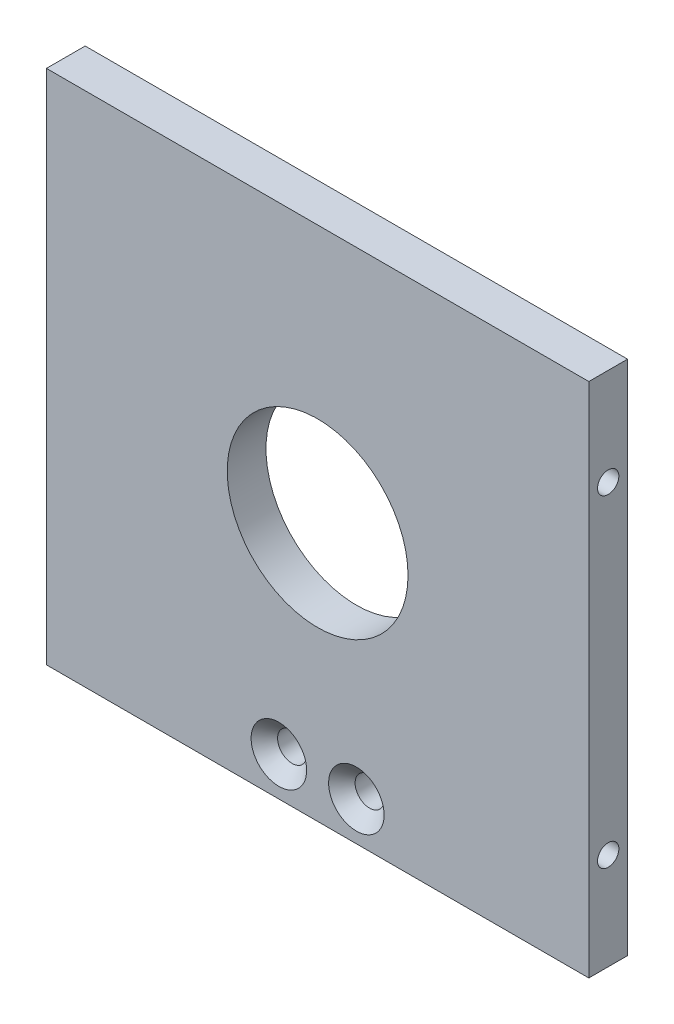
ISO-10303-21;
HEADER;
FILE_DESCRIPTION(('STEP AP214'),'2;1');
FILE_NAME('part.step','',(''),(''),'','','');
FILE_SCHEMA(('AUTOMOTIVE_DESIGN { 1 0 10303 214 1 1 1 1 }'));
ENDSEC;
DATA;
#1=APPLICATION_CONTEXT('core data for automotive mechanical design processes');
#2=APPLICATION_PROTOCOL_DEFINITION('international standard','automotive_design',2000,#1);
#3=PRODUCT_CONTEXT('',#1,'mechanical');
#4=PRODUCT('Part','Part','',(#3));
#5=PRODUCT_RELATED_PRODUCT_CATEGORY('part','',(#4));
#6=PRODUCT_DEFINITION_FORMATION('','',#4);
#7=PRODUCT_DEFINITION_CONTEXT('part definition',#1,'design');
#8=PRODUCT_DEFINITION('design','',#6,#7);
#9=PRODUCT_DEFINITION_SHAPE('','',#8);
#10=(LENGTH_UNIT() NAMED_UNIT(*) SI_UNIT(.MILLI.,.METRE.));
#11=(NAMED_UNIT(*) PLANE_ANGLE_UNIT() SI_UNIT($,.RADIAN.));
#12=(NAMED_UNIT(*) SI_UNIT($,.STERADIAN.) SOLID_ANGLE_UNIT());
#13=UNCERTAINTY_MEASURE_WITH_UNIT(LENGTH_MEASURE(1.E-05),#10,'distance_accuracy_value','');
#14=(GEOMETRIC_REPRESENTATION_CONTEXT(3) GLOBAL_UNCERTAINTY_ASSIGNED_CONTEXT((#13)) GLOBAL_UNIT_ASSIGNED_CONTEXT((#10,
#11,#12)) REPRESENTATION_CONTEXT('',''));
#15=CARTESIAN_POINT('',(0.,0.,0.));
#16=DIRECTION('',(0.,0.,1.));
#17=DIRECTION('',(1.,0.,0.));
#18=AXIS2_PLACEMENT_3D('',#15,#16,#17);
#19=CARTESIAN_POINT('',(0.,0.,3.));
#20=DIRECTION('',(0.,0.,-1.));
#21=DIRECTION('',(-1.,0.,0.));
#22=AXIS2_PLACEMENT_3D('',#19,#20,#21);
#23=PLANE('',#22);
#24=CARTESIAN_POINT('',(-6.,-34.,3.));
#25=DIRECTION('',(0.,0.,1.));
#26=DIRECTION('',(1.,0.,0.));
#27=AXIS2_PLACEMENT_3D('',#24,#25,#26);
#28=CIRCLE('',#27,4.3);
#29=CARTESIAN_POINT('',(-1.7,-34.,3.));
#30=VERTEX_POINT('',#29);
#31=EDGE_CURVE('E198',#30,#30,#28,.T.);
#32=ORIENTED_EDGE('',*,*,#31,.F.);
#33=EDGE_LOOP('',(#32));
#34=FACE_BOUND('',#33,.T.);
#35=CARTESIAN_POINT('',(6.,-34.,3.));
#36=DIRECTION('',(0.,0.,1.));
#37=DIRECTION('',(1.,0.,0.));
#38=AXIS2_PLACEMENT_3D('',#35,#36,#37);
#39=CIRCLE('',#38,4.3);
#40=CARTESIAN_POINT('',(10.3,-34.,3.));
#41=VERTEX_POINT('',#40);
#42=EDGE_CURVE('E187',#41,#41,#39,.T.);
#43=ORIENTED_EDGE('',*,*,#42,.F.);
#44=EDGE_LOOP('',(#43));
#45=FACE_BOUND('',#44,.T.);
#46=DIRECTION('',(0.,1.,0.));
#47=VECTOR('',#46,1.);
#48=CARTESIAN_POINT('',(42.,-40.,3.));
#49=LINE('',#48,#47);
#50=CARTESIAN_POINT('',(42.,-40.,3.));
#51=VERTEX_POINT('',#50);
#52=CARTESIAN_POINT('',(42.,40.,3.));
#53=VERTEX_POINT('',#52);
#54=EDGE_CURVE('E158',#51,#53,#49,.T.);
#55=ORIENTED_EDGE('',*,*,#54,.T.);
#56=DIRECTION('',(-1.,0.,0.));
#57=VECTOR('',#56,1.);
#58=CARTESIAN_POINT('',(-42.,40.,3.));
#59=LINE('',#58,#57);
#60=CARTESIAN_POINT('',(-42.,40.,3.));
#61=VERTEX_POINT('',#60);
#62=EDGE_CURVE('E100',#53,#61,#59,.T.);
#63=ORIENTED_EDGE('',*,*,#62,.T.);
#64=DIRECTION('',(0.,-1.,0.));
#65=VECTOR('',#64,1.);
#66=CARTESIAN_POINT('',(-42.,-40.,3.));
#67=LINE('',#66,#65);
#68=CARTESIAN_POINT('',(-42.,-40.,3.));
#69=VERTEX_POINT('',#68);
#70=EDGE_CURVE('E161',#61,#69,#67,.T.);
#71=ORIENTED_EDGE('',*,*,#70,.T.);
#72=DIRECTION('',(1.,0.,0.));
#73=VECTOR('',#72,1.);
#74=CARTESIAN_POINT('',(-42.,-40.,3.));
#75=LINE('',#74,#73);
#76=EDGE_CURVE('E66',#69,#51,#75,.T.);
#77=ORIENTED_EDGE('',*,*,#76,.T.);
#78=EDGE_LOOP('',(#55,#63,#71,#77));
#79=FACE_BOUND('',#78,.T.);
#80=CARTESIAN_POINT('',(0.,0.,3.));
#81=DIRECTION('',(0.,0.,1.));
#82=DIRECTION('',(1.,0.,0.));
#83=AXIS2_PLACEMENT_3D('',#80,#81,#82);
#84=CIRCLE('',#83,14.);
#85=CARTESIAN_POINT('',(14.,0.,3.));
#86=VERTEX_POINT('',#85);
#87=EDGE_CURVE('E151',#86,#86,#84,.T.);
#88=ORIENTED_EDGE('',*,*,#87,.F.);
#89=EDGE_LOOP('',(#88));
#90=FACE_BOUND('',#89,.T.);
#91=ADVANCED_FACE('F47',(#34,#45,#79,#90),#23,.F.);
#92=CARTESIAN_POINT('',(0.,0.,-3.));
#93=DIRECTION('',(0.,0.,-1.));
#94=DIRECTION('',(-1.,0.,0.));
#95=AXIS2_PLACEMENT_3D('',#92,#93,#94);
#96=PLANE('',#95);
#97=CARTESIAN_POINT('',(-6.,-34.,-3.));
#98=DIRECTION('',(0.,0.,-1.));
#99=DIRECTION('',(-1.,0.,0.));
#100=AXIS2_PLACEMENT_3D('',#97,#98,#99);
#101=CIRCLE('',#100,2.25);
#102=CARTESIAN_POINT('',(-8.25,-34.,-3.));
#103=VERTEX_POINT('',#102);
#104=EDGE_CURVE('E51',#103,#103,#101,.T.);
#105=ORIENTED_EDGE('',*,*,#104,.F.);
#106=EDGE_LOOP('',(#105));
#107=FACE_BOUND('',#106,.T.);
#108=CARTESIAN_POINT('',(6.,-34.,-3.));
#109=DIRECTION('',(0.,0.,-1.));
#110=DIRECTION('',(-1.,0.,0.));
#111=AXIS2_PLACEMENT_3D('',#108,#109,#110);
#112=CIRCLE('',#111,2.25);
#113=CARTESIAN_POINT('',(3.75,-34.,-3.));
#114=VERTEX_POINT('',#113);
#115=EDGE_CURVE('E130',#114,#114,#112,.T.);
#116=ORIENTED_EDGE('',*,*,#115,.F.);
#117=EDGE_LOOP('',(#116));
#118=FACE_BOUND('',#117,.T.);
#119=DIRECTION('',(0.,1.,0.));
#120=VECTOR('',#119,1.);
#121=CARTESIAN_POINT('',(42.,-40.,-3.));
#122=LINE('',#121,#120);
#123=CARTESIAN_POINT('',(42.,-40.,-3.));
#124=VERTEX_POINT('',#123);
#125=CARTESIAN_POINT('',(42.,40.,-3.));
#126=VERTEX_POINT('',#125);
#127=EDGE_CURVE('E154',#124,#126,#122,.T.);
#128=ORIENTED_EDGE('',*,*,#127,.F.);
#129=DIRECTION('',(1.,0.,0.));
#130=VECTOR('',#129,1.);
#131=CARTESIAN_POINT('',(-42.,-40.,-3.));
#132=LINE('',#131,#130);
#133=CARTESIAN_POINT('',(-42.,-40.,-3.));
#134=VERTEX_POINT('',#133);
#135=EDGE_CURVE('E93',#134,#124,#132,.T.);
#136=ORIENTED_EDGE('',*,*,#135,.F.);
#137=DIRECTION('',(0.,-1.,0.));
#138=VECTOR('',#137,1.);
#139=CARTESIAN_POINT('',(-42.,-40.,-3.));
#140=LINE('',#139,#138);
#141=CARTESIAN_POINT('',(-42.,40.,-3.));
#142=VERTEX_POINT('',#141);
#143=EDGE_CURVE('E87',#142,#134,#140,.T.);
#144=ORIENTED_EDGE('',*,*,#143,.F.);
#145=DIRECTION('',(-1.,0.,0.));
#146=VECTOR('',#145,1.);
#147=CARTESIAN_POINT('',(-42.,40.,-3.));
#148=LINE('',#147,#146);
#149=EDGE_CURVE('E169',#126,#142,#148,.T.);
#150=ORIENTED_EDGE('',*,*,#149,.F.);
#151=EDGE_LOOP('',(#128,#136,#144,#150));
#152=FACE_BOUND('',#151,.T.);
#153=CARTESIAN_POINT('',(0.,0.,-3.));
#154=DIRECTION('',(0.,0.,1.));
#155=DIRECTION('',(1.,0.,0.));
#156=AXIS2_PLACEMENT_3D('',#153,#154,#155);
#157=CIRCLE('',#156,14.);
#158=CARTESIAN_POINT('',(14.,0.,-3.));
#159=VERTEX_POINT('',#158);
#160=EDGE_CURVE('E150',#159,#159,#157,.T.);
#161=ORIENTED_EDGE('',*,*,#160,.T.);
#162=EDGE_LOOP('',(#161));
#163=FACE_BOUND('',#162,.T.);
#164=ADVANCED_FACE('F207',(#107,#118,#152,#163),#96,.T.);
#165=CARTESIAN_POINT('',(42.,-40.,3.));
#166=DIRECTION('',(-1.,0.,0.));
#167=DIRECTION('',(0.,0.,1.));
#168=AXIS2_PLACEMENT_3D('',#165,#166,#167);
#169=PLANE('',#168);
#170=CARTESIAN_POINT('',(42.,25.,0.));
#171=DIRECTION('',(1.,0.,0.));
#172=DIRECTION('',(0.,0.,-1.));
#173=AXIS2_PLACEMENT_3D('',#170,#171,#172);
#174=CIRCLE('',#173,1.64999999999999);
#175=CARTESIAN_POINT('',(42.,25.,-1.64999999999999));
#176=VERTEX_POINT('',#175);
#177=EDGE_CURVE('E124',#176,#176,#174,.T.);
#178=ORIENTED_EDGE('',*,*,#177,.F.);
#179=EDGE_LOOP('',(#178));
#180=FACE_BOUND('',#179,.T.);
#181=CARTESIAN_POINT('',(42.,-25.,0.));
#182=DIRECTION('',(1.,0.,0.));
#183=DIRECTION('',(0.,0.,-1.));
#184=AXIS2_PLACEMENT_3D('',#181,#182,#183);
#185=CIRCLE('',#184,1.64999999999999);
#186=CARTESIAN_POINT('',(42.,-25.,-1.64999999999999));
#187=VERTEX_POINT('',#186);
#188=EDGE_CURVE('E123',#187,#187,#185,.T.);
#189=ORIENTED_EDGE('',*,*,#188,.F.);
#190=EDGE_LOOP('',(#189));
#191=FACE_BOUND('',#190,.T.);
#192=ORIENTED_EDGE('',*,*,#127,.T.);
#193=DIRECTION('',(0.,0.,-1.));
#194=VECTOR('',#193,1.);
#195=CARTESIAN_POINT('',(42.,40.,3.));
#196=LINE('',#195,#194);
#197=EDGE_CURVE('E11',#53,#126,#196,.T.);
#198=ORIENTED_EDGE('',*,*,#197,.F.);
#199=ORIENTED_EDGE('',*,*,#54,.F.);
#200=DIRECTION('',(0.,0.,-1.));
#201=VECTOR('',#200,1.);
#202=CARTESIAN_POINT('',(42.,-40.,3.));
#203=LINE('',#202,#201);
#204=EDGE_CURVE('E166',#51,#124,#203,.T.);
#205=ORIENTED_EDGE('',*,*,#204,.T.);
#206=EDGE_LOOP('',(#192,#198,#199,#205));
#207=FACE_BOUND('',#206,.T.);
#208=ADVANCED_FACE('F49',(#180,#191,#207),#169,.F.);
#209=CARTESIAN_POINT('',(-42.,40.,3.));
#210=DIRECTION('',(0.,-1.,0.));
#211=DIRECTION('',(0.,0.,-1.));
#212=AXIS2_PLACEMENT_3D('',#209,#210,#211);
#213=PLANE('',#212);
#214=ORIENTED_EDGE('',*,*,#149,.T.);
#215=DIRECTION('',(0.,0.,-1.));
#216=VECTOR('',#215,1.);
#217=CARTESIAN_POINT('',(-42.,40.,3.));
#218=LINE('',#217,#216);
#219=EDGE_CURVE('E57',#61,#142,#218,.T.);
#220=ORIENTED_EDGE('',*,*,#219,.F.);
#221=ORIENTED_EDGE('',*,*,#62,.F.);
#222=ORIENTED_EDGE('',*,*,#197,.T.);
#223=EDGE_LOOP('',(#214,#220,#221,#222));
#224=FACE_BOUND('',#223,.T.);
#225=ADVANCED_FACE('F229',(#224),#213,.F.);
#226=CARTESIAN_POINT('',(-42.,-40.,3.));
#227=DIRECTION('',(1.,0.,0.));
#228=DIRECTION('',(0.,0.,-1.));
#229=AXIS2_PLACEMENT_3D('',#226,#227,#228);
#230=PLANE('',#229);
#231=CARTESIAN_POINT('',(-42.,25.,0.));
#232=DIRECTION('',(-1.,0.,0.));
#233=DIRECTION('',(0.,0.,1.));
#234=AXIS2_PLACEMENT_3D('',#231,#232,#233);
#235=CIRCLE('',#234,1.64999999999999);
#236=CARTESIAN_POINT('',(-42.,25.,1.64999999999999));
#237=VERTEX_POINT('',#236);
#238=EDGE_CURVE('E136',#237,#237,#235,.T.);
#239=ORIENTED_EDGE('',*,*,#238,.F.);
#240=EDGE_LOOP('',(#239));
#241=FACE_BOUND('',#240,.T.);
#242=CARTESIAN_POINT('',(-42.,-25.,0.));
#243=DIRECTION('',(-1.,0.,0.));
#244=DIRECTION('',(0.,0.,1.));
#245=AXIS2_PLACEMENT_3D('',#242,#243,#244);
#246=CIRCLE('',#245,1.64999999999999);
#247=CARTESIAN_POINT('',(-42.,-25.,1.65));
#248=VERTEX_POINT('',#247);
#249=EDGE_CURVE('E142',#248,#248,#246,.T.);
#250=ORIENTED_EDGE('',*,*,#249,.F.);
#251=EDGE_LOOP('',(#250));
#252=FACE_BOUND('',#251,.T.);
#253=ORIENTED_EDGE('',*,*,#143,.T.);
#254=DIRECTION('',(0.,0.,-1.));
#255=VECTOR('',#254,1.);
#256=CARTESIAN_POINT('',(-42.,-40.,3.));
#257=LINE('',#256,#255);
#258=EDGE_CURVE('E176',#69,#134,#257,.T.);
#259=ORIENTED_EDGE('',*,*,#258,.F.);
#260=ORIENTED_EDGE('',*,*,#70,.F.);
#261=ORIENTED_EDGE('',*,*,#219,.T.);
#262=EDGE_LOOP('',(#253,#259,#260,#261));
#263=FACE_BOUND('',#262,.T.);
#264=ADVANCED_FACE('F236',(#241,#252,#263),#230,.F.);
#265=CARTESIAN_POINT('',(-42.,-40.,3.));
#266=DIRECTION('',(0.,1.,0.));
#267=DIRECTION('',(0.,0.,1.));
#268=AXIS2_PLACEMENT_3D('',#265,#266,#267);
#269=PLANE('',#268);
#270=ORIENTED_EDGE('',*,*,#135,.T.);
#271=ORIENTED_EDGE('',*,*,#204,.F.);
#272=ORIENTED_EDGE('',*,*,#76,.F.);
#273=ORIENTED_EDGE('',*,*,#258,.T.);
#274=EDGE_LOOP('',(#270,#271,#272,#273));
#275=FACE_BOUND('',#274,.T.);
#276=ADVANCED_FACE('F219',(#275),#269,.F.);
#277=CARTESIAN_POINT('',(0.,0.,3.));
#278=DIRECTION('',(0.,0.,-1.));
#279=DIRECTION('',(-1.,0.,0.));
#280=AXIS2_PLACEMENT_3D('',#277,#278,#279);
#281=CYLINDRICAL_SURFACE('',#280,14.);
#282=ORIENTED_EDGE('',*,*,#87,.T.);
#283=EDGE_LOOP('',(#282));
#284=FACE_BOUND('',#283,.T.);
#285=ORIENTED_EDGE('',*,*,#160,.F.);
#286=EDGE_LOOP('',(#285));
#287=FACE_BOUND('',#286,.T.);
#288=ADVANCED_FACE('F215',(#284,#287),#281,.F.);
#289=CARTESIAN_POINT('',(-30.5,-25.,0.));
#290=DIRECTION('',(-1.,0.,0.));
#291=DIRECTION('',(0.,0.,1.));
#292=AXIS2_PLACEMENT_3D('',#289,#290,#291);
#293=CONICAL_SURFACE('',#292,1.64999999999999,1.02974425867665);
#294=CARTESIAN_POINT('',(-29.5085799786045,-25.,0.));
#295=VERTEX_POINT('',#294);
#296=VERTEX_LOOP('',#295);
#297=FACE_BOUND('',#296,.T.);
#298=CARTESIAN_POINT('',(-30.5,-25.,0.));
#299=DIRECTION('',(-1.,0.,0.));
#300=DIRECTION('',(0.,0.,1.));
#301=AXIS2_PLACEMENT_3D('',#298,#299,#300);
#302=CIRCLE('',#301,1.64999999999999);
#303=CARTESIAN_POINT('',(-30.5,-25.,1.64999999999999));
#304=VERTEX_POINT('',#303);
#305=EDGE_CURVE('E146',#304,#304,#302,.T.);
#306=ORIENTED_EDGE('',*,*,#305,.T.);
#307=EDGE_LOOP('',(#306));
#308=FACE_BOUND('',#307,.T.);
#309=ADVANCED_FACE('F218',(#297,#308),#293,.F.);
#310=CARTESIAN_POINT('',(-42.,-25.,0.));
#311=DIRECTION('',(-1.,0.,0.));
#312=DIRECTION('',(0.,0.,1.));
#313=AXIS2_PLACEMENT_3D('',#310,#311,#312);
#314=CYLINDRICAL_SURFACE('',#313,1.64999999999999);
#315=ORIENTED_EDGE('',*,*,#305,.F.);
#316=EDGE_LOOP('',(#315));
#317=FACE_BOUND('',#316,.T.);
#318=ORIENTED_EDGE('',*,*,#249,.T.);
#319=EDGE_LOOP('',(#318));
#320=FACE_BOUND('',#319,.T.);
#321=ADVANCED_FACE('F267',(#317,#320),#314,.F.);
#322=CARTESIAN_POINT('',(-30.5,25.,0.));
#323=DIRECTION('',(-1.,0.,0.));
#324=DIRECTION('',(0.,0.,1.));
#325=AXIS2_PLACEMENT_3D('',#322,#323,#324);
#326=CONICAL_SURFACE('',#325,1.64999999999999,1.02974425867665);
#327=CARTESIAN_POINT('',(-29.5085799786045,25.,0.));
#328=VERTEX_POINT('',#327);
#329=VERTEX_LOOP('',#328);
#330=FACE_BOUND('',#329,.T.);
#331=CARTESIAN_POINT('',(-30.5,25.,0.));
#332=DIRECTION('',(-1.,0.,0.));
#333=DIRECTION('',(0.,0.,1.));
#334=AXIS2_PLACEMENT_3D('',#331,#332,#333);
#335=CIRCLE('',#334,1.64999999999999);
#336=CARTESIAN_POINT('',(-30.5,25.,1.64999999999999));
#337=VERTEX_POINT('',#336);
#338=EDGE_CURVE('E139',#337,#337,#335,.T.);
#339=ORIENTED_EDGE('',*,*,#338,.T.);
#340=EDGE_LOOP('',(#339));
#341=FACE_BOUND('',#340,.T.);
#342=ADVANCED_FACE('F276',(#330,#341),#326,.F.);
#343=CARTESIAN_POINT('',(-42.,25.,0.));
#344=DIRECTION('',(-1.,0.,0.));
#345=DIRECTION('',(0.,0.,1.));
#346=AXIS2_PLACEMENT_3D('',#343,#344,#345);
#347=CYLINDRICAL_SURFACE('',#346,1.64999999999999);
#348=ORIENTED_EDGE('',*,*,#338,.F.);
#349=EDGE_LOOP('',(#348));
#350=FACE_BOUND('',#349,.T.);
#351=ORIENTED_EDGE('',*,*,#238,.T.);
#352=EDGE_LOOP('',(#351));
#353=FACE_BOUND('',#352,.T.);
#354=ADVANCED_FACE('F285',(#350,#353),#347,.F.);
#355=CARTESIAN_POINT('',(30.5,-25.,0.));
#356=DIRECTION('',(1.,0.,0.));
#357=DIRECTION('',(0.,0.,-1.));
#358=AXIS2_PLACEMENT_3D('',#355,#356,#357);
#359=CONICAL_SURFACE('',#358,1.64999999999999,1.02974425867665);
#360=CARTESIAN_POINT('',(29.5085799786045,-25.,0.));
#361=VERTEX_POINT('',#360);
#362=VERTEX_LOOP('',#361);
#363=FACE_BOUND('',#362,.T.);
#364=CARTESIAN_POINT('',(30.5,-25.,0.));
#365=DIRECTION('',(1.,0.,0.));
#366=DIRECTION('',(0.,0.,-1.));
#367=AXIS2_PLACEMENT_3D('',#364,#365,#366);
#368=CIRCLE('',#367,1.64999999999999);
#369=CARTESIAN_POINT('',(30.5,-25.,-1.64999999999998));
#370=VERTEX_POINT('',#369);
#371=EDGE_CURVE('E127',#370,#370,#368,.T.);
#372=ORIENTED_EDGE('',*,*,#371,.T.);
#373=EDGE_LOOP('',(#372));
#374=FACE_BOUND('',#373,.T.);
#375=ADVANCED_FACE('F294',(#363,#374),#359,.F.);
#376=CARTESIAN_POINT('',(42.,-25.,0.));
#377=DIRECTION('',(1.,0.,0.));
#378=DIRECTION('',(0.,0.,-1.));
#379=AXIS2_PLACEMENT_3D('',#376,#377,#378);
#380=CYLINDRICAL_SURFACE('',#379,1.64999999999999);
#381=ORIENTED_EDGE('',*,*,#371,.F.);
#382=EDGE_LOOP('',(#381));
#383=FACE_BOUND('',#382,.T.);
#384=ORIENTED_EDGE('',*,*,#188,.T.);
#385=EDGE_LOOP('',(#384));
#386=FACE_BOUND('',#385,.T.);
#387=ADVANCED_FACE('F117',(#383,#386),#380,.F.);
#388=CARTESIAN_POINT('',(30.5,25.,0.));
#389=DIRECTION('',(1.,0.,0.));
#390=DIRECTION('',(0.,0.,-1.));
#391=AXIS2_PLACEMENT_3D('',#388,#389,#390);
#392=CONICAL_SURFACE('',#391,1.64999999999999,1.02974425867665);
#393=CARTESIAN_POINT('',(29.5085799786045,25.,0.));
#394=VERTEX_POINT('',#393);
#395=VERTEX_LOOP('',#394);
#396=FACE_BOUND('',#395,.T.);
#397=CARTESIAN_POINT('',(30.5,25.,0.));
#398=DIRECTION('',(1.,0.,0.));
#399=DIRECTION('',(0.,0.,-1.));
#400=AXIS2_PLACEMENT_3D('',#397,#398,#399);
#401=CIRCLE('',#400,1.64999999999999);
#402=CARTESIAN_POINT('',(30.5,25.,-1.64999999999999));
#403=VERTEX_POINT('',#402);
#404=EDGE_CURVE('E121',#403,#403,#401,.T.);
#405=ORIENTED_EDGE('',*,*,#404,.T.);
#406=EDGE_LOOP('',(#405));
#407=FACE_BOUND('',#406,.T.);
#408=ADVANCED_FACE('F113',(#396,#407),#392,.F.);
#409=CARTESIAN_POINT('',(42.,25.,0.));
#410=DIRECTION('',(1.,0.,0.));
#411=DIRECTION('',(0.,0.,-1.));
#412=AXIS2_PLACEMENT_3D('',#409,#410,#411);
#413=CYLINDRICAL_SURFACE('',#412,1.64999999999999);
#414=ORIENTED_EDGE('',*,*,#404,.F.);
#415=EDGE_LOOP('',(#414));
#416=FACE_BOUND('',#415,.T.);
#417=ORIENTED_EDGE('',*,*,#177,.T.);
#418=EDGE_LOOP('',(#417));
#419=FACE_BOUND('',#418,.T.);
#420=ADVANCED_FACE('F116',(#416,#419),#413,.F.);
#421=CARTESIAN_POINT('',(6.,-34.,3.));
#422=DIRECTION('',(0.,0.,1.));
#423=DIRECTION('',(1.,0.,0.));
#424=AXIS2_PLACEMENT_3D('',#421,#422,#423);
#425=CYLINDRICAL_SURFACE('',#424,2.25);
#426=ORIENTED_EDGE('',*,*,#115,.T.);
#427=EDGE_LOOP('',(#426));
#428=FACE_BOUND('',#427,.T.);
#429=CARTESIAN_POINT('',(6.,-34.,0.949999999999999));
#430=DIRECTION('',(0.,0.,1.));
#431=DIRECTION('',(1.,0.,0.));
#432=AXIS2_PLACEMENT_3D('',#429,#430,#431);
#433=CIRCLE('',#432,2.25);
#434=CARTESIAN_POINT('',(8.24999999999999,-34.,0.949999999999999));
#435=VERTEX_POINT('',#434);
#436=EDGE_CURVE('E181',#435,#435,#433,.T.);
#437=ORIENTED_EDGE('',*,*,#436,.T.);
#438=EDGE_LOOP('',(#437));
#439=FACE_BOUND('',#438,.T.);
#440=ADVANCED_FACE('F321',(#428,#439),#425,.F.);
#441=CARTESIAN_POINT('',(6.,-34.,3.));
#442=DIRECTION('',(0.,0.,1.));
#443=DIRECTION('',(1.,0.,0.));
#444=AXIS2_PLACEMENT_3D('',#441,#442,#443);
#445=CONICAL_SURFACE('',#444,4.3,0.785398163397448);
#446=ORIENTED_EDGE('',*,*,#436,.F.);
#447=EDGE_LOOP('',(#446));
#448=FACE_BOUND('',#447,.T.);
#449=ORIENTED_EDGE('',*,*,#42,.T.);
#450=EDGE_LOOP('',(#449));
#451=FACE_BOUND('',#450,.T.);
#452=ADVANCED_FACE('F328',(#448,#451),#445,.F.);
#453=CARTESIAN_POINT('',(-6.,-34.,3.));
#454=DIRECTION('',(0.,0.,1.));
#455=DIRECTION('',(1.,0.,0.));
#456=AXIS2_PLACEMENT_3D('',#453,#454,#455);
#457=CYLINDRICAL_SURFACE('',#456,2.25);
#458=ORIENTED_EDGE('',*,*,#104,.T.);
#459=EDGE_LOOP('',(#458));
#460=FACE_BOUND('',#459,.T.);
#461=CARTESIAN_POINT('',(-6.,-34.,0.949999999999999));
#462=DIRECTION('',(0.,0.,1.));
#463=DIRECTION('',(1.,0.,0.));
#464=AXIS2_PLACEMENT_3D('',#461,#462,#463);
#465=CIRCLE('',#464,2.25);
#466=CARTESIAN_POINT('',(-3.75000000000001,-34.,0.949999999999999));
#467=VERTEX_POINT('',#466);
#468=EDGE_CURVE('E194',#467,#467,#465,.T.);
#469=ORIENTED_EDGE('',*,*,#468,.T.);
#470=EDGE_LOOP('',(#469));
#471=FACE_BOUND('',#470,.T.);
#472=ADVANCED_FACE('F335',(#460,#471),#457,.F.);
#473=CARTESIAN_POINT('',(-6.,-34.,3.));
#474=DIRECTION('',(0.,0.,1.));
#475=DIRECTION('',(1.,0.,0.));
#476=AXIS2_PLACEMENT_3D('',#473,#474,#475);
#477=CONICAL_SURFACE('',#476,4.3,0.785398163397448);
#478=ORIENTED_EDGE('',*,*,#468,.F.);
#479=EDGE_LOOP('',(#478));
#480=FACE_BOUND('',#479,.T.);
#481=ORIENTED_EDGE('',*,*,#31,.T.);
#482=EDGE_LOOP('',(#481));
#483=FACE_BOUND('',#482,.T.);
#484=ADVANCED_FACE('F203',(#480,#483),#477,.F.);
#485=CLOSED_SHELL('',(#91,#164,#208,#225,#264,#276,#288,#309,#321,#342,#354,#375,#387,#408,#420,
#440,#452,#472,#484));
#486=MANIFOLD_SOLID_BREP('B2',#485);
#487=ADVANCED_BREP_SHAPE_REPRESENTATION('',(#18,#486),#14);
#488=SHAPE_DEFINITION_REPRESENTATION(#9,#487);
ENDSEC;
END-ISO-10303-21;
